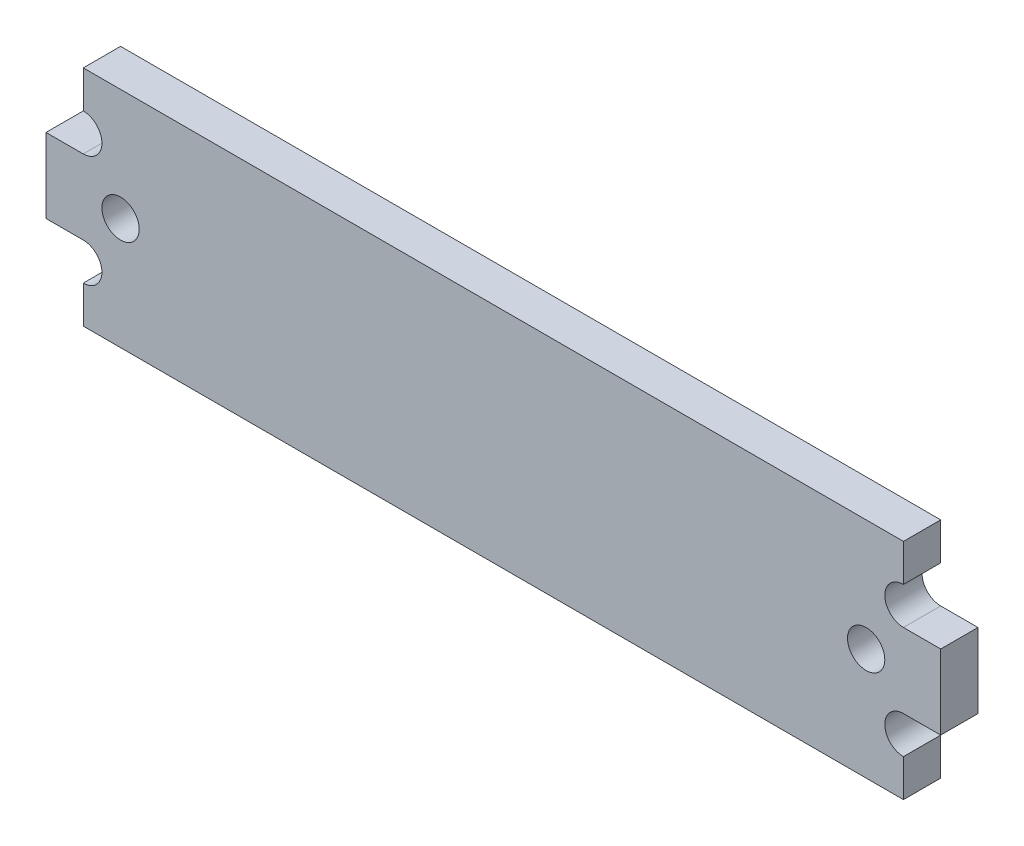
ISO-10303-21;
HEADER;
FILE_DESCRIPTION(('STEP AP214'),'2;1');
FILE_NAME('part.step','',(''),(''),'','','');
FILE_SCHEMA(('AUTOMOTIVE_DESIGN { 1 0 10303 214 1 1 1 1 }'));
ENDSEC;
DATA;
#1=APPLICATION_CONTEXT('core data for automotive mechanical design processes');
#2=APPLICATION_PROTOCOL_DEFINITION('international standard','automotive_design',2000,#1);
#3=PRODUCT_CONTEXT('',#1,'mechanical');
#4=PRODUCT('Part','Part','',(#3));
#5=PRODUCT_RELATED_PRODUCT_CATEGORY('part','',(#4));
#6=PRODUCT_DEFINITION_FORMATION('','',#4);
#7=PRODUCT_DEFINITION_CONTEXT('part definition',#1,'design');
#8=PRODUCT_DEFINITION('design','',#6,#7);
#9=PRODUCT_DEFINITION_SHAPE('','',#8);
#10=(LENGTH_UNIT() NAMED_UNIT(*) SI_UNIT(.MILLI.,.METRE.));
#11=(NAMED_UNIT(*) PLANE_ANGLE_UNIT() SI_UNIT($,.RADIAN.));
#12=(NAMED_UNIT(*) SI_UNIT($,.STERADIAN.) SOLID_ANGLE_UNIT());
#13=UNCERTAINTY_MEASURE_WITH_UNIT(LENGTH_MEASURE(1.E-05),#10,'distance_accuracy_value','');
#14=(GEOMETRIC_REPRESENTATION_CONTEXT(3) GLOBAL_UNCERTAINTY_ASSIGNED_CONTEXT((#13)) GLOBAL_UNIT_ASSIGNED_CONTEXT((#10,
#11,#12)) REPRESENTATION_CONTEXT('',''));
#15=CARTESIAN_POINT('',(0.,0.,0.));
#16=DIRECTION('',(0.,0.,1.));
#17=DIRECTION('',(1.,0.,0.));
#18=AXIS2_PLACEMENT_3D('',#15,#16,#17);
#19=CARTESIAN_POINT('',(-31.3906695938529,1.575,2.));
#20=DIRECTION('',(0.,0.,1.));
#21=DIRECTION('',(1.,0.,0.));
#22=AXIS2_PLACEMENT_3D('',#19,#20,#21);
#23=PLANE('',#22);
#24=CARTESIAN_POINT('',(-29.3906695938529,-1.425,2.));
#25=DIRECTION('',(0.,0.,1.));
#26=DIRECTION('',(1.,0.,0.));
#27=AXIS2_PLACEMENT_3D('',#24,#25,#26);
#28=CIRCLE('',#27,1.);
#29=CARTESIAN_POINT('',(-28.3906695938529,-1.425,2.));
#30=VERTEX_POINT('',#29);
#31=EDGE_CURVE('E182',#30,#30,#28,.T.);
#32=ORIENTED_EDGE('',*,*,#31,.F.);
#33=EDGE_LOOP('',(#32));
#34=FACE_BOUND('',#33,.T.);
#35=DIRECTION('',(0.,-1.,0.));
#36=VECTOR('',#35,1.);
#37=CARTESIAN_POINT('',(-31.3906695938529,4.575,2.));
#38=LINE('',#37,#36);
#39=CARTESIAN_POINT('',(-31.3906695938529,4.575,2.));
#40=VERTEX_POINT('',#39);
#41=CARTESIAN_POINT('',(-31.3906695938529,2.575,2.));
#42=VERTEX_POINT('',#41);
#43=EDGE_CURVE('E209',#40,#42,#38,.T.);
#44=ORIENTED_EDGE('',*,*,#43,.T.);
#45=CARTESIAN_POINT('',(-31.3906695938529,1.575,2.));
#46=DIRECTION('',(0.,0.,-1.));
#47=DIRECTION('',(1.,0.,0.));
#48=AXIS2_PLACEMENT_3D('',#45,#46,#47);
#49=CIRCLE('',#48,1.);
#50=CARTESIAN_POINT('',(-31.3906695938529,0.575000000000003,2.));
#51=VERTEX_POINT('',#50);
#52=EDGE_CURVE('E117',#42,#51,#49,.T.);
#53=ORIENTED_EDGE('',*,*,#52,.T.);
#54=DIRECTION('',(-1.,0.,0.));
#55=VECTOR('',#54,1.);
#56=CARTESIAN_POINT('',(-31.3906695938529,0.575000000000003,2.));
#57=LINE('',#56,#55);
#58=CARTESIAN_POINT('',(-33.3906695938529,0.575000000000003,2.));
#59=VERTEX_POINT('',#58);
#60=EDGE_CURVE('E248',#51,#59,#57,.T.);
#61=ORIENTED_EDGE('',*,*,#60,.T.);
#62=DIRECTION('',(0.,-1.,0.));
#63=VECTOR('',#62,1.);
#64=CARTESIAN_POINT('',(-33.3906695938529,0.575000000000003,2.));
#65=LINE('',#64,#63);
#66=CARTESIAN_POINT('',(-33.3906695938529,-3.425,2.));
#67=VERTEX_POINT('',#66);
#68=EDGE_CURVE('E267',#59,#67,#65,.T.);
#69=ORIENTED_EDGE('',*,*,#68,.T.);
#70=DIRECTION('',(1.,0.,0.));
#71=VECTOR('',#70,1.);
#72=CARTESIAN_POINT('',(-31.3906695938529,-3.425,2.));
#73=LINE('',#72,#71);
#74=CARTESIAN_POINT('',(-31.3906695938529,-3.425,2.));
#75=VERTEX_POINT('',#74);
#76=EDGE_CURVE('E264',#67,#75,#73,.T.);
#77=ORIENTED_EDGE('',*,*,#76,.T.);
#78=CARTESIAN_POINT('',(-31.3906695938529,-4.425,2.));
#79=DIRECTION('',(0.,0.,-1.));
#80=DIRECTION('',(-1.,0.,0.));
#81=AXIS2_PLACEMENT_3D('',#78,#79,#80);
#82=CIRCLE('',#81,1.);
#83=CARTESIAN_POINT('',(-31.3906695938529,-5.425,2.));
#84=VERTEX_POINT('',#83);
#85=EDGE_CURVE('E266',#75,#84,#82,.T.);
#86=ORIENTED_EDGE('',*,*,#85,.T.);
#87=DIRECTION('',(0.,-1.,0.));
#88=VECTOR('',#87,1.);
#89=CARTESIAN_POINT('',(-31.3906695938529,-5.425,2.));
#90=LINE('',#89,#88);
#91=CARTESIAN_POINT('',(-31.3906695938529,-7.425,2.));
#92=VERTEX_POINT('',#91);
#93=EDGE_CURVE('E269',#84,#92,#90,.T.);
#94=ORIENTED_EDGE('',*,*,#93,.T.);
#95=DIRECTION('',(1.,0.,0.));
#96=VECTOR('',#95,1.);
#97=CARTESIAN_POINT('',(-31.3906695938529,-7.425,2.));
#98=LINE('',#97,#96);
#99=CARTESIAN_POINT('',(12.6093304061471,-7.425,2.));
#100=VERTEX_POINT('',#99);
#101=EDGE_CURVE('E275',#92,#100,#98,.T.);
#102=ORIENTED_EDGE('',*,*,#101,.T.);
#103=DIRECTION('',(0.,1.,0.));
#104=VECTOR('',#103,1.);
#105=CARTESIAN_POINT('',(12.6093304061471,-5.425,2.));
#106=LINE('',#105,#104);
#107=CARTESIAN_POINT('',(12.6093304061471,-5.425,2.));
#108=VERTEX_POINT('',#107);
#109=EDGE_CURVE('E277',#100,#108,#106,.T.);
#110=ORIENTED_EDGE('',*,*,#109,.T.);
#111=CARTESIAN_POINT('',(12.6093304061471,-4.425,2.));
#112=DIRECTION('',(0.,0.,-1.));
#113=DIRECTION('',(1.,0.,0.));
#114=AXIS2_PLACEMENT_3D('',#111,#112,#113);
#115=CIRCLE('',#114,1.);
#116=CARTESIAN_POINT('',(12.6093304061471,-3.425,2.));
#117=VERTEX_POINT('',#116);
#118=EDGE_CURVE('E279',#108,#117,#115,.T.);
#119=ORIENTED_EDGE('',*,*,#118,.T.);
#120=DIRECTION('',(1.,0.,0.));
#121=VECTOR('',#120,1.);
#122=CARTESIAN_POINT('',(12.6093304061471,-3.425,2.));
#123=LINE('',#122,#121);
#124=CARTESIAN_POINT('',(14.6093304061471,-3.425,2.));
#125=VERTEX_POINT('',#124);
#126=EDGE_CURVE('E281',#117,#125,#123,.T.);
#127=ORIENTED_EDGE('',*,*,#126,.T.);
#128=DIRECTION('',(0.,1.,0.));
#129=VECTOR('',#128,1.);
#130=CARTESIAN_POINT('',(14.6093304061471,0.575000000000003,2.));
#131=LINE('',#130,#129);
#132=CARTESIAN_POINT('',(14.6093304061471,0.575000000000003,2.));
#133=VERTEX_POINT('',#132);
#134=EDGE_CURVE('E283',#125,#133,#131,.T.);
#135=ORIENTED_EDGE('',*,*,#134,.T.);
#136=DIRECTION('',(-1.,0.,0.));
#137=VECTOR('',#136,1.);
#138=CARTESIAN_POINT('',(12.6093304061471,0.575000000000003,2.));
#139=LINE('',#138,#137);
#140=CARTESIAN_POINT('',(12.6093304061471,0.575000000000003,2.));
#141=VERTEX_POINT('',#140);
#142=EDGE_CURVE('E160',#133,#141,#139,.T.);
#143=ORIENTED_EDGE('',*,*,#142,.T.);
#144=CARTESIAN_POINT('',(12.6093304061471,1.575,2.));
#145=DIRECTION('',(0.,0.,-1.));
#146=DIRECTION('',(-1.,0.,0.));
#147=AXIS2_PLACEMENT_3D('',#144,#145,#146);
#148=CIRCLE('',#147,1.);
#149=CARTESIAN_POINT('',(12.6093304061471,2.575,2.));
#150=VERTEX_POINT('',#149);
#151=EDGE_CURVE('E154',#141,#150,#148,.T.);
#152=ORIENTED_EDGE('',*,*,#151,.T.);
#153=DIRECTION('',(0.,1.,0.));
#154=VECTOR('',#153,1.);
#155=CARTESIAN_POINT('',(12.6093304061471,4.575,2.));
#156=LINE('',#155,#154);
#157=CARTESIAN_POINT('',(12.6093304061471,4.575,2.));
#158=VERTEX_POINT('',#157);
#159=EDGE_CURVE('E158',#150,#158,#156,.T.);
#160=ORIENTED_EDGE('',*,*,#159,.T.);
#161=DIRECTION('',(-1.,0.,0.));
#162=VECTOR('',#161,1.);
#163=CARTESIAN_POINT('',(-31.3906695938529,4.575,2.));
#164=LINE('',#163,#162);
#165=EDGE_CURVE('E50',#158,#40,#164,.T.);
#166=ORIENTED_EDGE('',*,*,#165,.T.);
#167=EDGE_LOOP('',(#44,#53,#61,#69,#77,#86,#94,#102,#110,#119,#127,#135,#143,#152,#160,#166));
#168=FACE_BOUND('',#167,.T.);
#169=CARTESIAN_POINT('',(10.6093304061471,-1.425,2.));
#170=DIRECTION('',(0.,0.,1.));
#171=DIRECTION('',(1.,0.,0.));
#172=AXIS2_PLACEMENT_3D('',#169,#170,#171);
#173=CIRCLE('',#172,1.);
#174=CARTESIAN_POINT('',(11.6093304061471,-1.425,2.));
#175=VERTEX_POINT('',#174);
#176=EDGE_CURVE('E325',#175,#175,#173,.T.);
#177=ORIENTED_EDGE('',*,*,#176,.F.);
#178=EDGE_LOOP('',(#177));
#179=FACE_BOUND('',#178,.T.);
#180=ADVANCED_FACE('F33',(#34,#168,#179),#23,.T.);
#181=CARTESIAN_POINT('',(-31.3906695938529,1.575,0.));
#182=DIRECTION('',(0.,0.,1.));
#183=DIRECTION('',(1.,0.,0.));
#184=AXIS2_PLACEMENT_3D('',#181,#182,#183);
#185=PLANE('',#184);
#186=DIRECTION('',(0.,-1.,0.));
#187=VECTOR('',#186,1.);
#188=CARTESIAN_POINT('',(-31.3906695938529,4.575,0.));
#189=LINE('',#188,#187);
#190=CARTESIAN_POINT('',(-31.3906695938529,4.575,0.));
#191=VERTEX_POINT('',#190);
#192=CARTESIAN_POINT('',(-31.3906695938529,2.575,0.));
#193=VERTEX_POINT('',#192);
#194=EDGE_CURVE('E178',#191,#193,#189,.T.);
#195=ORIENTED_EDGE('',*,*,#194,.F.);
#196=DIRECTION('',(-1.,0.,0.));
#197=VECTOR('',#196,1.);
#198=CARTESIAN_POINT('',(-31.3906695938529,4.575,0.));
#199=LINE('',#198,#197);
#200=CARTESIAN_POINT('',(12.6093304061471,4.575,0.));
#201=VERTEX_POINT('',#200);
#202=EDGE_CURVE('E109',#201,#191,#199,.T.);
#203=ORIENTED_EDGE('',*,*,#202,.F.);
#204=DIRECTION('',(0.,1.,0.));
#205=VECTOR('',#204,1.);
#206=CARTESIAN_POINT('',(12.6093304061471,4.575,0.));
#207=LINE('',#206,#205);
#208=CARTESIAN_POINT('',(12.6093304061471,2.575,0.));
#209=VERTEX_POINT('',#208);
#210=EDGE_CURVE('E103',#209,#201,#207,.T.);
#211=ORIENTED_EDGE('',*,*,#210,.F.);
#212=CARTESIAN_POINT('',(12.6093304061471,1.575,0.));
#213=DIRECTION('',(0.,0.,-1.));
#214=DIRECTION('',(-1.,0.,0.));
#215=AXIS2_PLACEMENT_3D('',#212,#213,#214);
#216=CIRCLE('',#215,1.);
#217=CARTESIAN_POINT('',(12.6093304061471,0.575000000000003,0.));
#218=VERTEX_POINT('',#217);
#219=EDGE_CURVE('E168',#218,#209,#216,.T.);
#220=ORIENTED_EDGE('',*,*,#219,.F.);
#221=DIRECTION('',(-1.,0.,0.));
#222=VECTOR('',#221,1.);
#223=CARTESIAN_POINT('',(12.6093304061471,0.575000000000003,0.));
#224=LINE('',#223,#222);
#225=CARTESIAN_POINT('',(14.6093304061471,0.575000000000003,0.));
#226=VERTEX_POINT('',#225);
#227=EDGE_CURVE('E204',#226,#218,#224,.T.);
#228=ORIENTED_EDGE('',*,*,#227,.F.);
#229=DIRECTION('',(0.,1.,0.));
#230=VECTOR('',#229,1.);
#231=CARTESIAN_POINT('',(14.6093304061471,0.575000000000003,0.));
#232=LINE('',#231,#230);
#233=CARTESIAN_POINT('',(14.6093304061471,-3.425,0.));
#234=VERTEX_POINT('',#233);
#235=EDGE_CURVE('E202',#234,#226,#232,.T.);
#236=ORIENTED_EDGE('',*,*,#235,.F.);
#237=DIRECTION('',(1.,0.,0.));
#238=VECTOR('',#237,1.);
#239=CARTESIAN_POINT('',(12.6093304061471,-3.425,0.));
#240=LINE('',#239,#238);
#241=CARTESIAN_POINT('',(12.6093304061471,-3.425,0.));
#242=VERTEX_POINT('',#241);
#243=EDGE_CURVE('E200',#242,#234,#240,.T.);
#244=ORIENTED_EDGE('',*,*,#243,.F.);
#245=CARTESIAN_POINT('',(12.6093304061471,-4.425,0.));
#246=DIRECTION('',(0.,0.,-1.));
#247=DIRECTION('',(1.,0.,0.));
#248=AXIS2_PLACEMENT_3D('',#245,#246,#247);
#249=CIRCLE('',#248,1.);
#250=CARTESIAN_POINT('',(12.6093304061471,-5.425,0.));
#251=VERTEX_POINT('',#250);
#252=EDGE_CURVE('E198',#251,#242,#249,.T.);
#253=ORIENTED_EDGE('',*,*,#252,.F.);
#254=DIRECTION('',(0.,1.,0.));
#255=VECTOR('',#254,1.);
#256=CARTESIAN_POINT('',(12.6093304061471,-5.425,0.));
#257=LINE('',#256,#255);
#258=CARTESIAN_POINT('',(12.6093304061471,-7.425,0.));
#259=VERTEX_POINT('',#258);
#260=EDGE_CURVE('E196',#259,#251,#257,.T.);
#261=ORIENTED_EDGE('',*,*,#260,.F.);
#262=DIRECTION('',(1.,0.,0.));
#263=VECTOR('',#262,1.);
#264=CARTESIAN_POINT('',(-31.3906695938529,-7.425,0.));
#265=LINE('',#264,#263);
#266=CARTESIAN_POINT('',(-31.3906695938529,-7.425,0.));
#267=VERTEX_POINT('',#266);
#268=EDGE_CURVE('E194',#267,#259,#265,.T.);
#269=ORIENTED_EDGE('',*,*,#268,.F.);
#270=DIRECTION('',(0.,-1.,0.));
#271=VECTOR('',#270,1.);
#272=CARTESIAN_POINT('',(-31.3906695938529,-5.425,0.));
#273=LINE('',#272,#271);
#274=CARTESIAN_POINT('',(-31.3906695938529,-5.425,0.));
#275=VERTEX_POINT('',#274);
#276=EDGE_CURVE('E192',#275,#267,#273,.T.);
#277=ORIENTED_EDGE('',*,*,#276,.F.);
#278=CARTESIAN_POINT('',(-31.3906695938529,-4.425,0.));
#279=DIRECTION('',(0.,0.,-1.));
#280=DIRECTION('',(-1.,0.,0.));
#281=AXIS2_PLACEMENT_3D('',#278,#279,#280);
#282=CIRCLE('',#281,1.);
#283=CARTESIAN_POINT('',(-31.3906695938529,-3.425,0.));
#284=VERTEX_POINT('',#283);
#285=EDGE_CURVE('E190',#284,#275,#282,.T.);
#286=ORIENTED_EDGE('',*,*,#285,.F.);
#287=DIRECTION('',(1.,0.,0.));
#288=VECTOR('',#287,1.);
#289=CARTESIAN_POINT('',(-31.3906695938529,-3.425,0.));
#290=LINE('',#289,#288);
#291=CARTESIAN_POINT('',(-33.3906695938529,-3.425,0.));
#292=VERTEX_POINT('',#291);
#293=EDGE_CURVE('E188',#292,#284,#290,.T.);
#294=ORIENTED_EDGE('',*,*,#293,.F.);
#295=DIRECTION('',(0.,-1.,0.));
#296=VECTOR('',#295,1.);
#297=CARTESIAN_POINT('',(-33.3906695938529,0.575000000000003,0.));
#298=LINE('',#297,#296);
#299=CARTESIAN_POINT('',(-33.3906695938529,0.575000000000003,0.));
#300=VERTEX_POINT('',#299);
#301=EDGE_CURVE('E186',#300,#292,#298,.T.);
#302=ORIENTED_EDGE('',*,*,#301,.F.);
#303=DIRECTION('',(-1.,0.,0.));
#304=VECTOR('',#303,1.);
#305=CARTESIAN_POINT('',(-31.3906695938529,0.575000000000003,0.));
#306=LINE('',#305,#304);
#307=CARTESIAN_POINT('',(-31.3906695938529,0.575000000000003,0.));
#308=VERTEX_POINT('',#307);
#309=EDGE_CURVE('E184',#308,#300,#306,.T.);
#310=ORIENTED_EDGE('',*,*,#309,.F.);
#311=CARTESIAN_POINT('',(-31.3906695938529,1.575,0.));
#312=DIRECTION('',(0.,0.,-1.));
#313=DIRECTION('',(1.,0.,0.));
#314=AXIS2_PLACEMENT_3D('',#311,#312,#313);
#315=CIRCLE('',#314,1.);
#316=EDGE_CURVE('E181',#193,#308,#315,.T.);
#317=ORIENTED_EDGE('',*,*,#316,.F.);
#318=EDGE_LOOP('',(#195,#203,#211,#220,#228,#236,#244,#253,#261,#269,#277,#286,#294,#302,#310,#317));
#319=FACE_BOUND('',#318,.T.);
#320=CARTESIAN_POINT('',(-29.3906695938529,-1.425,0.));
#321=DIRECTION('',(0.,0.,1.));
#322=DIRECTION('',(1.,0.,0.));
#323=AXIS2_PLACEMENT_3D('',#320,#321,#322);
#324=CIRCLE('',#323,1.);
#325=CARTESIAN_POINT('',(-28.3906695938529,-1.425,0.));
#326=VERTEX_POINT('',#325);
#327=EDGE_CURVE('E331',#326,#326,#324,.T.);
#328=ORIENTED_EDGE('',*,*,#327,.T.);
#329=EDGE_LOOP('',(#328));
#330=FACE_BOUND('',#329,.T.);
#331=CARTESIAN_POINT('',(10.6093304061471,-1.425,0.));
#332=DIRECTION('',(0.,0.,1.));
#333=DIRECTION('',(1.,0.,0.));
#334=AXIS2_PLACEMENT_3D('',#331,#332,#333);
#335=CIRCLE('',#334,1.);
#336=CARTESIAN_POINT('',(11.6093304061471,-1.425,0.));
#337=VERTEX_POINT('',#336);
#338=EDGE_CURVE('E328',#337,#337,#335,.T.);
#339=ORIENTED_EDGE('',*,*,#338,.T.);
#340=EDGE_LOOP('',(#339));
#341=FACE_BOUND('',#340,.T.);
#342=ADVANCED_FACE('F252',(#319,#330,#341),#185,.F.);
#343=CARTESIAN_POINT('',(-31.3906695938529,4.575,2.));
#344=DIRECTION('',(1.,0.,0.));
#345=DIRECTION('',(0.,0.,-1.));
#346=AXIS2_PLACEMENT_3D('',#343,#344,#345);
#347=PLANE('',#346);
#348=ORIENTED_EDGE('',*,*,#194,.T.);
#349=DIRECTION('',(0.,0.,-1.));
#350=VECTOR('',#349,1.);
#351=CARTESIAN_POINT('',(-31.3906695938529,2.575,2.));
#352=LINE('',#351,#350);
#353=EDGE_CURVE('E11',#42,#193,#352,.T.);
#354=ORIENTED_EDGE('',*,*,#353,.F.);
#355=ORIENTED_EDGE('',*,*,#43,.F.);
#356=DIRECTION('',(0.,0.,-1.));
#357=VECTOR('',#356,1.);
#358=CARTESIAN_POINT('',(-31.3906695938529,4.575,2.));
#359=LINE('',#358,#357);
#360=EDGE_CURVE('E174',#40,#191,#359,.T.);
#361=ORIENTED_EDGE('',*,*,#360,.T.);
#362=EDGE_LOOP('',(#348,#354,#355,#361));
#363=FACE_BOUND('',#362,.T.);
#364=ADVANCED_FACE('F35',(#363),#347,.F.);
#365=CARTESIAN_POINT('',(-31.3906695938529,1.575,2.));
#366=DIRECTION('',(0.,0.,-1.));
#367=DIRECTION('',(-1.,0.,0.));
#368=AXIS2_PLACEMENT_3D('',#365,#366,#367);
#369=CYLINDRICAL_SURFACE('',#368,1.);
#370=ORIENTED_EDGE('',*,*,#316,.T.);
#371=DIRECTION('',(0.,0.,-1.));
#372=VECTOR('',#371,1.);
#373=CARTESIAN_POINT('',(-31.3906695938529,0.575000000000003,2.));
#374=LINE('',#373,#372);
#375=EDGE_CURVE('E42',#51,#308,#374,.T.);
#376=ORIENTED_EDGE('',*,*,#375,.F.);
#377=ORIENTED_EDGE('',*,*,#52,.F.);
#378=ORIENTED_EDGE('',*,*,#353,.T.);
#379=EDGE_LOOP('',(#370,#376,#377,#378));
#380=FACE_BOUND('',#379,.T.);
#381=ADVANCED_FACE('F464',(#380),#369,.F.);
#382=CARTESIAN_POINT('',(-31.3906695938529,0.575000000000003,2.));
#383=DIRECTION('',(0.,-1.,0.));
#384=DIRECTION('',(1.,0.,0.));
#385=AXIS2_PLACEMENT_3D('',#382,#383,#384);
#386=PLANE('',#385);
#387=ORIENTED_EDGE('',*,*,#309,.T.);
#388=DIRECTION('',(0.,0.,-1.));
#389=VECTOR('',#388,1.);
#390=CARTESIAN_POINT('',(-33.3906695938529,0.575000000000003,2.));
#391=LINE('',#390,#389);
#392=EDGE_CURVE('E240',#59,#300,#391,.T.);
#393=ORIENTED_EDGE('',*,*,#392,.F.);
#394=ORIENTED_EDGE('',*,*,#60,.F.);
#395=ORIENTED_EDGE('',*,*,#375,.T.);
#396=EDGE_LOOP('',(#387,#393,#394,#395));
#397=FACE_BOUND('',#396,.T.);
#398=ADVANCED_FACE('F246',(#397),#386,.F.);
#399=CARTESIAN_POINT('',(-33.3906695938529,0.575000000000003,2.));
#400=DIRECTION('',(1.,0.,0.));
#401=DIRECTION('',(0.,0.,-1.));
#402=AXIS2_PLACEMENT_3D('',#399,#400,#401);
#403=PLANE('',#402);
#404=ORIENTED_EDGE('',*,*,#301,.T.);
#405=DIRECTION('',(0.,0.,-1.));
#406=VECTOR('',#405,1.);
#407=CARTESIAN_POINT('',(-33.3906695938529,-3.425,2.));
#408=LINE('',#407,#406);
#409=EDGE_CURVE('E237',#67,#292,#408,.T.);
#410=ORIENTED_EDGE('',*,*,#409,.F.);
#411=ORIENTED_EDGE('',*,*,#68,.F.);
#412=ORIENTED_EDGE('',*,*,#392,.T.);
#413=EDGE_LOOP('',(#404,#410,#411,#412));
#414=FACE_BOUND('',#413,.T.);
#415=ADVANCED_FACE('F258',(#414),#403,.F.);
#416=CARTESIAN_POINT('',(-31.3906695938529,-3.425,2.));
#417=DIRECTION('',(0.,1.,0.));
#418=DIRECTION('',(0.,0.,1.));
#419=AXIS2_PLACEMENT_3D('',#416,#417,#418);
#420=PLANE('',#419);
#421=ORIENTED_EDGE('',*,*,#293,.T.);
#422=DIRECTION('',(0.,0.,-1.));
#423=VECTOR('',#422,1.);
#424=CARTESIAN_POINT('',(-31.3906695938529,-3.425,2.));
#425=LINE('',#424,#423);
#426=EDGE_CURVE('E234',#75,#284,#425,.T.);
#427=ORIENTED_EDGE('',*,*,#426,.F.);
#428=ORIENTED_EDGE('',*,*,#76,.F.);
#429=ORIENTED_EDGE('',*,*,#409,.T.);
#430=EDGE_LOOP('',(#421,#427,#428,#429));
#431=FACE_BOUND('',#430,.T.);
#432=ADVANCED_FACE('F262',(#431),#420,.F.);
#433=CARTESIAN_POINT('',(-31.3906695938529,-4.425,2.));
#434=DIRECTION('',(0.,0.,-1.));
#435=DIRECTION('',(-1.,0.,0.));
#436=AXIS2_PLACEMENT_3D('',#433,#434,#435);
#437=CYLINDRICAL_SURFACE('',#436,1.);
#438=ORIENTED_EDGE('',*,*,#285,.T.);
#439=DIRECTION('',(0.,0.,-1.));
#440=VECTOR('',#439,1.);
#441=CARTESIAN_POINT('',(-31.3906695938529,-5.425,2.));
#442=LINE('',#441,#440);
#443=EDGE_CURVE('E231',#84,#275,#442,.T.);
#444=ORIENTED_EDGE('',*,*,#443,.F.);
#445=ORIENTED_EDGE('',*,*,#85,.F.);
#446=ORIENTED_EDGE('',*,*,#426,.T.);
#447=EDGE_LOOP('',(#438,#444,#445,#446));
#448=FACE_BOUND('',#447,.T.);
#449=ADVANCED_FACE('F429',(#448),#437,.F.);
#450=CARTESIAN_POINT('',(-31.3906695938529,-5.425,2.));
#451=DIRECTION('',(1.,0.,0.));
#452=DIRECTION('',(0.,0.,-1.));
#453=AXIS2_PLACEMENT_3D('',#450,#451,#452);
#454=PLANE('',#453);
#455=ORIENTED_EDGE('',*,*,#276,.T.);
#456=DIRECTION('',(0.,0.,-1.));
#457=VECTOR('',#456,1.);
#458=CARTESIAN_POINT('',(-31.3906695938529,-7.425,2.));
#459=LINE('',#458,#457);
#460=EDGE_CURVE('E228',#92,#267,#459,.T.);
#461=ORIENTED_EDGE('',*,*,#460,.F.);
#462=ORIENTED_EDGE('',*,*,#93,.F.);
#463=ORIENTED_EDGE('',*,*,#443,.T.);
#464=EDGE_LOOP('',(#455,#461,#462,#463));
#465=FACE_BOUND('',#464,.T.);
#466=ADVANCED_FACE('F419',(#465),#454,.F.);
#467=CARTESIAN_POINT('',(-31.3906695938529,-7.425,2.));
#468=DIRECTION('',(0.,1.,0.));
#469=DIRECTION('',(0.,0.,1.));
#470=AXIS2_PLACEMENT_3D('',#467,#468,#469);
#471=PLANE('',#470);
#472=ORIENTED_EDGE('',*,*,#268,.T.);
#473=DIRECTION('',(0.,0.,-1.));
#474=VECTOR('',#473,1.);
#475=CARTESIAN_POINT('',(12.6093304061471,-7.425,2.));
#476=LINE('',#475,#474);
#477=EDGE_CURVE('E225',#100,#259,#476,.T.);
#478=ORIENTED_EDGE('',*,*,#477,.F.);
#479=ORIENTED_EDGE('',*,*,#101,.F.);
#480=ORIENTED_EDGE('',*,*,#460,.T.);
#481=EDGE_LOOP('',(#472,#478,#479,#480));
#482=FACE_BOUND('',#481,.T.);
#483=ADVANCED_FACE('F409',(#482),#471,.F.);
#484=CARTESIAN_POINT('',(12.6093304061471,-5.425,2.));
#485=DIRECTION('',(-1.,0.,0.));
#486=DIRECTION('',(0.,0.,1.));
#487=AXIS2_PLACEMENT_3D('',#484,#485,#486);
#488=PLANE('',#487);
#489=ORIENTED_EDGE('',*,*,#260,.T.);
#490=DIRECTION('',(0.,0.,-1.));
#491=VECTOR('',#490,1.);
#492=CARTESIAN_POINT('',(12.6093304061471,-5.425,2.));
#493=LINE('',#492,#491);
#494=EDGE_CURVE('E222',#108,#251,#493,.T.);
#495=ORIENTED_EDGE('',*,*,#494,.F.);
#496=ORIENTED_EDGE('',*,*,#109,.F.);
#497=ORIENTED_EDGE('',*,*,#477,.T.);
#498=EDGE_LOOP('',(#489,#495,#496,#497));
#499=FACE_BOUND('',#498,.T.);
#500=ADVANCED_FACE('F399',(#499),#488,.F.);
#501=CARTESIAN_POINT('',(12.6093304061471,-4.425,2.));
#502=DIRECTION('',(0.,0.,-1.));
#503=DIRECTION('',(-1.,0.,0.));
#504=AXIS2_PLACEMENT_3D('',#501,#502,#503);
#505=CYLINDRICAL_SURFACE('',#504,1.);
#506=ORIENTED_EDGE('',*,*,#252,.T.);
#507=DIRECTION('',(0.,0.,-1.));
#508=VECTOR('',#507,1.);
#509=CARTESIAN_POINT('',(12.6093304061471,-3.425,2.));
#510=LINE('',#509,#508);
#511=EDGE_CURVE('E219',#117,#242,#510,.T.);
#512=ORIENTED_EDGE('',*,*,#511,.F.);
#513=ORIENTED_EDGE('',*,*,#118,.F.);
#514=ORIENTED_EDGE('',*,*,#494,.T.);
#515=EDGE_LOOP('',(#506,#512,#513,#514));
#516=FACE_BOUND('',#515,.T.);
#517=ADVANCED_FACE('F389',(#516),#505,.F.);
#518=CARTESIAN_POINT('',(12.6093304061471,-3.425,2.));
#519=DIRECTION('',(0.,1.,0.));
#520=DIRECTION('',(0.,0.,1.));
#521=AXIS2_PLACEMENT_3D('',#518,#519,#520);
#522=PLANE('',#521);
#523=ORIENTED_EDGE('',*,*,#243,.T.);
#524=DIRECTION('',(0.,0.,-1.));
#525=VECTOR('',#524,1.);
#526=CARTESIAN_POINT('',(14.6093304061471,-3.425,2.));
#527=LINE('',#526,#525);
#528=EDGE_CURVE('E216',#125,#234,#527,.T.);
#529=ORIENTED_EDGE('',*,*,#528,.F.);
#530=ORIENTED_EDGE('',*,*,#126,.F.);
#531=ORIENTED_EDGE('',*,*,#511,.T.);
#532=EDGE_LOOP('',(#523,#529,#530,#531));
#533=FACE_BOUND('',#532,.T.);
#534=ADVANCED_FACE('F380',(#533),#522,.F.);
#535=CARTESIAN_POINT('',(14.6093304061471,0.575000000000003,2.));
#536=DIRECTION('',(-1.,0.,0.));
#537=DIRECTION('',(0.,0.,1.));
#538=AXIS2_PLACEMENT_3D('',#535,#536,#537);
#539=PLANE('',#538);
#540=ORIENTED_EDGE('',*,*,#235,.T.);
#541=DIRECTION('',(0.,0.,-1.));
#542=VECTOR('',#541,1.);
#543=CARTESIAN_POINT('',(14.6093304061471,0.575000000000003,2.));
#544=LINE('',#543,#542);
#545=EDGE_CURVE('E213',#133,#226,#544,.T.);
#546=ORIENTED_EDGE('',*,*,#545,.F.);
#547=ORIENTED_EDGE('',*,*,#134,.F.);
#548=ORIENTED_EDGE('',*,*,#528,.T.);
#549=EDGE_LOOP('',(#540,#546,#547,#548));
#550=FACE_BOUND('',#549,.T.);
#551=ADVANCED_FACE('F289',(#550),#539,.F.);
#552=CARTESIAN_POINT('',(12.6093304061471,0.575000000000003,2.));
#553=DIRECTION('',(0.,-1.,0.));
#554=DIRECTION('',(1.,0.,0.));
#555=AXIS2_PLACEMENT_3D('',#552,#553,#554);
#556=PLANE('',#555);
#557=ORIENTED_EDGE('',*,*,#227,.T.);
#558=DIRECTION('',(0.,0.,-1.));
#559=VECTOR('',#558,1.);
#560=CARTESIAN_POINT('',(12.6093304061471,0.575000000000003,2.));
#561=LINE('',#560,#559);
#562=EDGE_CURVE('E169',#141,#218,#561,.T.);
#563=ORIENTED_EDGE('',*,*,#562,.F.);
#564=ORIENTED_EDGE('',*,*,#142,.F.);
#565=ORIENTED_EDGE('',*,*,#545,.T.);
#566=EDGE_LOOP('',(#557,#563,#564,#565));
#567=FACE_BOUND('',#566,.T.);
#568=ADVANCED_FACE('F293',(#567),#556,.F.);
#569=CARTESIAN_POINT('',(12.6093304061471,1.575,2.));
#570=DIRECTION('',(0.,0.,-1.));
#571=DIRECTION('',(-1.,0.,0.));
#572=AXIS2_PLACEMENT_3D('',#569,#570,#571);
#573=CYLINDRICAL_SURFACE('',#572,1.);
#574=ORIENTED_EDGE('',*,*,#219,.T.);
#575=DIRECTION('',(0.,0.,-1.));
#576=VECTOR('',#575,1.);
#577=CARTESIAN_POINT('',(12.6093304061471,2.575,2.));
#578=LINE('',#577,#576);
#579=EDGE_CURVE('E165',#150,#209,#578,.T.);
#580=ORIENTED_EDGE('',*,*,#579,.F.);
#581=ORIENTED_EDGE('',*,*,#151,.F.);
#582=ORIENTED_EDGE('',*,*,#562,.T.);
#583=EDGE_LOOP('',(#574,#580,#581,#582));
#584=FACE_BOUND('',#583,.T.);
#585=ADVANCED_FACE('F166',(#584),#573,.F.);
#586=CARTESIAN_POINT('',(12.6093304061471,4.575,2.));
#587=DIRECTION('',(-1.,0.,0.));
#588=DIRECTION('',(0.,0.,1.));
#589=AXIS2_PLACEMENT_3D('',#586,#587,#588);
#590=PLANE('',#589);
#591=ORIENTED_EDGE('',*,*,#210,.T.);
#592=DIRECTION('',(0.,0.,-1.));
#593=VECTOR('',#592,1.);
#594=CARTESIAN_POINT('',(12.6093304061471,4.575,2.));
#595=LINE('',#594,#593);
#596=EDGE_CURVE('E170',#158,#201,#595,.T.);
#597=ORIENTED_EDGE('',*,*,#596,.F.);
#598=ORIENTED_EDGE('',*,*,#159,.F.);
#599=ORIENTED_EDGE('',*,*,#579,.T.);
#600=EDGE_LOOP('',(#591,#597,#598,#599));
#601=FACE_BOUND('',#600,.T.);
#602=ADVANCED_FACE('F172',(#601),#590,.F.);
#603=CARTESIAN_POINT('',(-31.3906695938529,4.575,2.));
#604=DIRECTION('',(0.,-1.,0.));
#605=DIRECTION('',(0.,0.,-1.));
#606=AXIS2_PLACEMENT_3D('',#603,#604,#605);
#607=PLANE('',#606);
#608=ORIENTED_EDGE('',*,*,#202,.T.);
#609=ORIENTED_EDGE('',*,*,#360,.F.);
#610=ORIENTED_EDGE('',*,*,#165,.F.);
#611=ORIENTED_EDGE('',*,*,#596,.T.);
#612=EDGE_LOOP('',(#608,#609,#610,#611));
#613=FACE_BOUND('',#612,.T.);
#614=ADVANCED_FACE('F297',(#613),#607,.F.);
#615=CARTESIAN_POINT('',(-29.3906695938529,-1.425,2.));
#616=DIRECTION('',(0.,0.,-1.));
#617=DIRECTION('',(-1.,0.,0.));
#618=AXIS2_PLACEMENT_3D('',#615,#616,#617);
#619=CYLINDRICAL_SURFACE('',#618,1.);
#620=ORIENTED_EDGE('',*,*,#31,.T.);
#621=EDGE_LOOP('',(#620));
#622=FACE_BOUND('',#621,.T.);
#623=ORIENTED_EDGE('',*,*,#327,.F.);
#624=EDGE_LOOP('',(#623));
#625=FACE_BOUND('',#624,.T.);
#626=ADVANCED_FACE('F299',(#622,#625),#619,.F.);
#627=CARTESIAN_POINT('',(10.6093304061471,-1.425,2.));
#628=DIRECTION('',(0.,0.,-1.));
#629=DIRECTION('',(-1.,0.,0.));
#630=AXIS2_PLACEMENT_3D('',#627,#628,#629);
#631=CYLINDRICAL_SURFACE('',#630,1.);
#632=ORIENTED_EDGE('',*,*,#176,.T.);
#633=EDGE_LOOP('',(#632));
#634=FACE_BOUND('',#633,.T.);
#635=ORIENTED_EDGE('',*,*,#338,.F.);
#636=EDGE_LOOP('',(#635));
#637=FACE_BOUND('',#636,.T.);
#638=ADVANCED_FACE('F305',(#634,#637),#631,.F.);
#639=CLOSED_SHELL('',(#180,#342,#364,#381,#398,#415,#432,#449,#466,#483,#500,#517,#534,#551,
#568,#585,#602,#614,#626,#638));
#640=MANIFOLD_SOLID_BREP('B2',#639);
#641=ADVANCED_BREP_SHAPE_REPRESENTATION('',(#18,#640),#14);
#642=SHAPE_DEFINITION_REPRESENTATION(#9,#641);
ENDSEC;
END-ISO-10303-21;
